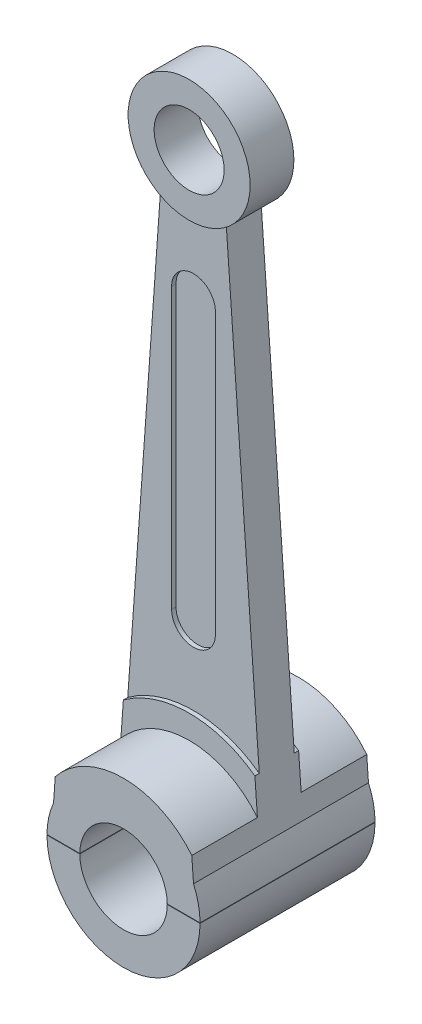
ISO-10303-21;
HEADER;
FILE_DESCRIPTION(('STEP AP214'),'2;1');
FILE_NAME('part.step','',(''),(''),'','','');
FILE_SCHEMA(('AUTOMOTIVE_DESIGN { 1 0 10303 214 1 1 1 1 }'));
ENDSEC;
DATA;
#1=APPLICATION_CONTEXT('core data for automotive mechanical design processes');
#2=APPLICATION_PROTOCOL_DEFINITION('international standard','automotive_design',2000,#1);
#3=PRODUCT_CONTEXT('',#1,'mechanical');
#4=PRODUCT('Part','Part','',(#3));
#5=PRODUCT_RELATED_PRODUCT_CATEGORY('part','',(#4));
#6=PRODUCT_DEFINITION_FORMATION('','',#4);
#7=PRODUCT_DEFINITION_CONTEXT('part definition',#1,'design');
#8=PRODUCT_DEFINITION('design','',#6,#7);
#9=PRODUCT_DEFINITION_SHAPE('','',#8);
#10=(LENGTH_UNIT() NAMED_UNIT(*) SI_UNIT(.MILLI.,.METRE.));
#11=(NAMED_UNIT(*) PLANE_ANGLE_UNIT() SI_UNIT($,.RADIAN.));
#12=(NAMED_UNIT(*) SI_UNIT($,.STERADIAN.) SOLID_ANGLE_UNIT());
#13=UNCERTAINTY_MEASURE_WITH_UNIT(LENGTH_MEASURE(1.E-05),#10,'distance_accuracy_value','');
#14=(GEOMETRIC_REPRESENTATION_CONTEXT(3) GLOBAL_UNCERTAINTY_ASSIGNED_CONTEXT((#13)) GLOBAL_UNIT_ASSIGNED_CONTEXT((#10,
#11,#12)) REPRESENTATION_CONTEXT('',''));
#15=CARTESIAN_POINT('',(0.,0.,0.));
#16=DIRECTION('',(0.,0.,1.));
#17=DIRECTION('',(1.,0.,0.));
#18=AXIS2_PLACEMENT_3D('',#15,#16,#17);
#19=CARTESIAN_POINT('',(-2.23895912387311,-6.14381045300894,-13.75));
#20=DIRECTION('',(0.,0.,1.));
#21=DIRECTION('',(1.,0.,0.));
#22=AXIS2_PLACEMENT_3D('',#19,#20,#21);
#23=CYLINDRICAL_SURFACE('',#22,1.75);
#24=CARTESIAN_POINT('',(-2.23895912387311,-6.14381045300894,-2.));
#25=DIRECTION('',(0.,0.,1.));
#26=DIRECTION('',(1.,0.,0.));
#27=AXIS2_PLACEMENT_3D('',#24,#25,#26);
#28=CIRCLE('',#27,1.75);
#29=CARTESIAN_POINT('',(-3.9889305522113,-6.13381045300894,-2.));
#30=VERTEX_POINT('',#29);
#31=CARTESIAN_POINT('',(-3.83895912387311,-5.43493810907105,-2.));
#32=VERTEX_POINT('',#31);
#33=EDGE_CURVE('E304',#30,#32,#28,.F.);
#34=ORIENTED_EDGE('',*,*,#33,.F.);
#35=DIRECTION('',(0.,0.,1.));
#36=VECTOR('',#35,1.);
#37=CARTESIAN_POINT('',(-3.9889305522113,-6.13381045300894,-13.75));
#38=LINE('',#37,#36);
#39=CARTESIAN_POINT('',(-3.9889305522113,-6.13381045300894,2.));
#40=VERTEX_POINT('',#39);
#41=EDGE_CURVE('E351',#30,#40,#38,.T.);
#42=ORIENTED_EDGE('',*,*,#41,.T.);
#43=CARTESIAN_POINT('',(-2.23895912387311,-6.14381045300894,2.));
#44=DIRECTION('',(0.,0.,1.));
#45=DIRECTION('',(1.,0.,0.));
#46=AXIS2_PLACEMENT_3D('',#43,#44,#45);
#47=CIRCLE('',#46,1.75);
#48=CARTESIAN_POINT('',(-3.83895912387311,-5.43493810907105,2.));
#49=VERTEX_POINT('',#48);
#50=EDGE_CURVE('E286',#40,#49,#47,.F.);
#51=ORIENTED_EDGE('',*,*,#50,.T.);
#52=DIRECTION('',(0.,0.,1.));
#53=VECTOR('',#52,1.);
#54=CARTESIAN_POINT('',(-3.83895912387311,-5.43493810907105,-13.75));
#55=LINE('',#54,#53);
#56=EDGE_CURVE('E301',#32,#49,#55,.T.);
#57=ORIENTED_EDGE('',*,*,#56,.F.);
#58=EDGE_LOOP('',(#34,#42,#51,#57));
#59=FACE_BOUND('',#58,.T.);
#60=ADVANCED_FACE('F51',(#59),#23,.T.);
#61=CARTESIAN_POINT('',(-2.23895912387311,-6.14381045300894,0.5));
#62=DIRECTION('',(0.,0.,-1.));
#63=DIRECTION('',(-1.,0.,0.));
#64=AXIS2_PLACEMENT_3D('',#61,#62,#63);
#65=CYLINDRICAL_SURFACE('',#64,2.54);
#66=CARTESIAN_POINT('',(-2.23895912387311,-6.14381045300894,0.5));
#67=DIRECTION('',(0.,0.,1.));
#68=DIRECTION('',(1.,0.,0.));
#69=AXIS2_PLACEMENT_3D('',#66,#67,#68);
#70=CIRCLE('',#69,2.54);
#71=CARTESIAN_POINT('',(-0.735317686791805,-4.09669970156141,0.5));
#72=VERTEX_POINT('',#71);
#73=CARTESIAN_POINT('',(-3.74260056095441,-4.09669970156141,0.5));
#74=VERTEX_POINT('',#73);
#75=EDGE_CURVE('E204',#72,#74,#70,.T.);
#76=ORIENTED_EDGE('',*,*,#75,.F.);
#77=DIRECTION('',(0.,0.,-1.));
#78=VECTOR('',#77,1.);
#79=CARTESIAN_POINT('',(-0.735317686791805,-4.09669970156141,0.5));
#80=LINE('',#79,#78);
#81=CARTESIAN_POINT('',(-0.735317686791805,-4.09669970156141,0.4));
#82=VERTEX_POINT('',#81);
#83=EDGE_CURVE('E282',#72,#82,#80,.T.);
#84=ORIENTED_EDGE('',*,*,#83,.T.);
#85=CARTESIAN_POINT('',(-2.23895912387311,-6.14381045300894,0.4));
#86=DIRECTION('',(0.,0.,1.));
#87=DIRECTION('',(1.,0.,0.));
#88=AXIS2_PLACEMENT_3D('',#85,#86,#87);
#89=CIRCLE('',#88,2.54);
#90=CARTESIAN_POINT('',(-3.74260056095441,-4.09669970156141,0.4));
#91=VERTEX_POINT('',#90);
#92=EDGE_CURVE('E175',#82,#91,#89,.T.);
#93=ORIENTED_EDGE('',*,*,#92,.T.);
#94=DIRECTION('',(0.,0.,-1.));
#95=VECTOR('',#94,1.);
#96=CARTESIAN_POINT('',(-3.74260056095441,-4.09669970156141,0.5));
#97=LINE('',#96,#95);
#98=EDGE_CURVE('E136',#91,#74,#97,.F.);
#99=ORIENTED_EDGE('',*,*,#98,.T.);
#100=EDGE_LOOP('',(#76,#84,#93,#99));
#101=FACE_BOUND('',#100,.T.);
#102=ADVANCED_FACE('F534',(#101),#65,.T.);
#103=CARTESIAN_POINT('',(-2.23895912387311,4.54618954699106,0.4));
#104=DIRECTION('',(0.,0.,-1.));
#105=DIRECTION('',(-1.,0.,0.));
#106=AXIS2_PLACEMENT_3D('',#103,#104,#105);
#107=CYLINDRICAL_SURFACE('',#106,0.499999999999999);
#108=DIRECTION('',(0.,0.,-1.));
#109=VECTOR('',#108,1.);
#110=CARTESIAN_POINT('',(-1.73895912387311,4.54618954699106,0.4));
#111=LINE('',#110,#109);
#112=CARTESIAN_POINT('',(-1.73895912387311,4.54618954699106,-0.3));
#113=VERTEX_POINT('',#112);
#114=CARTESIAN_POINT('',(-1.73895912387311,4.54618954699106,-0.4));
#115=VERTEX_POINT('',#114);
#116=EDGE_CURVE('E389',#113,#115,#111,.T.);
#117=ORIENTED_EDGE('',*,*,#116,.F.);
#118=CARTESIAN_POINT('',(-2.23895912387311,4.54618954699106,-0.3));
#119=DIRECTION('',(0.,0.,1.));
#120=DIRECTION('',(1.,0.,0.));
#121=AXIS2_PLACEMENT_3D('',#118,#119,#120);
#122=CIRCLE('',#121,0.499999999999999);
#123=CARTESIAN_POINT('',(-2.73895912387311,4.54618954699106,-0.3));
#124=VERTEX_POINT('',#123);
#125=EDGE_CURVE('E213',#113,#124,#122,.T.);
#126=ORIENTED_EDGE('',*,*,#125,.T.);
#127=DIRECTION('',(0.,0.,-1.));
#128=VECTOR('',#127,1.);
#129=CARTESIAN_POINT('',(-2.73895912387311,4.54618954699106,0.4));
#130=LINE('',#129,#128);
#131=CARTESIAN_POINT('',(-2.73895912387311,4.54618954699106,-0.4));
#132=VERTEX_POINT('',#131);
#133=EDGE_CURVE('E217',#124,#132,#130,.T.);
#134=ORIENTED_EDGE('',*,*,#133,.T.);
#135=CARTESIAN_POINT('',(-2.23895912387311,4.54618954699106,-0.4));
#136=DIRECTION('',(0.,0.,1.));
#137=DIRECTION('',(1.,0.,0.));
#138=AXIS2_PLACEMENT_3D('',#135,#136,#137);
#139=CIRCLE('',#138,0.499999999999999);
#140=EDGE_CURVE('E191',#115,#132,#139,.T.);
#141=ORIENTED_EDGE('',*,*,#140,.F.);
#142=EDGE_LOOP('',(#117,#126,#134,#141));
#143=FACE_BOUND('',#142,.T.);
#144=ADVANCED_FACE('F542',(#143),#107,.F.);
#145=CARTESIAN_POINT('',(-1.73895912387311,0.,0.4));
#146=DIRECTION('',(1.,0.,0.));
#147=DIRECTION('',(0.,1.,0.));
#148=AXIS2_PLACEMENT_3D('',#145,#146,#147);
#149=PLANE('',#148);
#150=DIRECTION('',(0.,-1.,0.));
#151=VECTOR('',#150,1.);
#152=CARTESIAN_POINT('',(-1.73895912387311,0.,-0.3));
#153=LINE('',#152,#151);
#154=CARTESIAN_POINT('',(-1.73895912387311,-1.85247213225215,-0.3));
#155=VERTEX_POINT('',#154);
#156=EDGE_CURVE('E218',#113,#155,#153,.T.);
#157=ORIENTED_EDGE('',*,*,#156,.F.);
#158=ORIENTED_EDGE('',*,*,#116,.T.);
#159=DIRECTION('',(0.,-1.,0.));
#160=VECTOR('',#159,1.);
#161=CARTESIAN_POINT('',(-1.73895912387311,0.,-0.4));
#162=LINE('',#161,#160);
#163=CARTESIAN_POINT('',(-1.73895912387311,-1.85247213225215,-0.4));
#164=VERTEX_POINT('',#163);
#165=EDGE_CURVE('E228',#115,#164,#162,.T.);
#166=ORIENTED_EDGE('',*,*,#165,.T.);
#167=DIRECTION('',(0.,0.,-1.));
#168=VECTOR('',#167,1.);
#169=CARTESIAN_POINT('',(-1.73895912387311,-1.85247213225215,0.4));
#170=LINE('',#169,#168);
#171=EDGE_CURVE('E212',#155,#164,#170,.T.);
#172=ORIENTED_EDGE('',*,*,#171,.F.);
#173=EDGE_LOOP('',(#157,#158,#166,#172));
#174=FACE_BOUND('',#173,.T.);
#175=ADVANCED_FACE('F541',(#174),#149,.F.);
#176=CARTESIAN_POINT('',(-2.23895912387311,-1.85247213225215,0.4));
#177=DIRECTION('',(0.,0.,-1.));
#178=DIRECTION('',(-1.,0.,0.));
#179=AXIS2_PLACEMENT_3D('',#176,#177,#178);
#180=CYLINDRICAL_SURFACE('',#179,0.5);
#181=DIRECTION('',(0.,0.,-1.));
#182=VECTOR('',#181,1.);
#183=CARTESIAN_POINT('',(-2.73895912387311,-1.85247213225215,0.4));
#184=LINE('',#183,#182);
#185=CARTESIAN_POINT('',(-2.73895912387311,-1.85247213225215,-0.3));
#186=VERTEX_POINT('',#185);
#187=CARTESIAN_POINT('',(-2.73895912387311,-1.85247213225215,-0.4));
#188=VERTEX_POINT('',#187);
#189=EDGE_CURVE('E163',#186,#188,#184,.T.);
#190=ORIENTED_EDGE('',*,*,#189,.F.);
#191=CARTESIAN_POINT('',(-2.23895912387311,-1.85247213225215,-0.3));
#192=DIRECTION('',(0.,0.,1.));
#193=DIRECTION('',(1.,0.,0.));
#194=AXIS2_PLACEMENT_3D('',#191,#192,#193);
#195=CIRCLE('',#194,0.5);
#196=EDGE_CURVE('E224',#186,#155,#195,.T.);
#197=ORIENTED_EDGE('',*,*,#196,.T.);
#198=ORIENTED_EDGE('',*,*,#171,.T.);
#199=CARTESIAN_POINT('',(-2.23895912387311,-1.85247213225215,-0.4));
#200=DIRECTION('',(0.,0.,1.));
#201=DIRECTION('',(1.,0.,0.));
#202=AXIS2_PLACEMENT_3D('',#199,#200,#201);
#203=CIRCLE('',#202,0.5);
#204=EDGE_CURVE('E403',#188,#164,#203,.T.);
#205=ORIENTED_EDGE('',*,*,#204,.F.);
#206=EDGE_LOOP('',(#190,#197,#198,#205));
#207=FACE_BOUND('',#206,.T.);
#208=ADVANCED_FACE('F441',(#207),#180,.F.);
#209=CARTESIAN_POINT('',(-2.73895912387311,0.,0.4));
#210=DIRECTION('',(1.,0.,0.));
#211=DIRECTION('',(0.,1.,0.));
#212=AXIS2_PLACEMENT_3D('',#209,#210,#211);
#213=PLANE('',#212);
#214=ORIENTED_EDGE('',*,*,#133,.F.);
#215=DIRECTION('',(0.,-1.,0.));
#216=VECTOR('',#215,1.);
#217=CARTESIAN_POINT('',(-2.73895912387311,0.,-0.3));
#218=LINE('',#217,#216);
#219=EDGE_CURVE('E170',#124,#186,#218,.T.);
#220=ORIENTED_EDGE('',*,*,#219,.T.);
#221=ORIENTED_EDGE('',*,*,#189,.T.);
#222=DIRECTION('',(0.,-1.,0.));
#223=VECTOR('',#222,1.);
#224=CARTESIAN_POINT('',(-2.73895912387311,0.,-0.4));
#225=LINE('',#224,#223);
#226=EDGE_CURVE('E404',#132,#188,#225,.T.);
#227=ORIENTED_EDGE('',*,*,#226,.F.);
#228=EDGE_LOOP('',(#214,#220,#221,#227));
#229=FACE_BOUND('',#228,.T.);
#230=ADVANCED_FACE('F430',(#229),#213,.T.);
#231=CARTESIAN_POINT('',(-2.23895912387311,7.54618954699106,0.5));
#232=DIRECTION('',(0.,0.,-1.));
#233=DIRECTION('',(-1.,0.,0.));
#234=AXIS2_PLACEMENT_3D('',#231,#232,#233);
#235=CYLINDRICAL_SURFACE('',#234,1.395);
#236=CARTESIAN_POINT('',(-2.23895912387311,7.54618954699106,0.4));
#237=DIRECTION('',(0.,0.,1.));
#238=DIRECTION('',(1.,0.,0.));
#239=AXIS2_PLACEMENT_3D('',#236,#237,#238);
#240=CIRCLE('',#239,1.395);
#241=CARTESIAN_POINT('',(-2.98895912387311,6.36995615178414,0.399999999999999));
#242=VERTEX_POINT('',#241);
#243=CARTESIAN_POINT('',(-1.48895912387311,6.36995615178414,0.399999999999999));
#244=VERTEX_POINT('',#243);
#245=EDGE_CURVE('E151',#242,#244,#240,.T.);
#246=ORIENTED_EDGE('',*,*,#245,.T.);
#247=DIRECTION('',(0.,0.,-1.));
#248=VECTOR('',#247,1.);
#249=CARTESIAN_POINT('',(-1.48895912387311,6.36995615178413,0.4));
#250=LINE('',#249,#248);
#251=CARTESIAN_POINT('',(-1.48895912387311,6.36995615178414,-0.399999999999999));
#252=VERTEX_POINT('',#251);
#253=EDGE_CURVE('E162',#244,#252,#250,.T.);
#254=ORIENTED_EDGE('',*,*,#253,.T.);
#255=CARTESIAN_POINT('',(-2.23895912387311,7.54618954699106,-0.4));
#256=DIRECTION('',(0.,0.,1.));
#257=DIRECTION('',(1.,0.,0.));
#258=AXIS2_PLACEMENT_3D('',#255,#256,#257);
#259=CIRCLE('',#258,1.395);
#260=CARTESIAN_POINT('',(-2.98895912387311,6.36995615178414,-0.399999999999999));
#261=VERTEX_POINT('',#260);
#262=EDGE_CURVE('E153',#261,#252,#259,.T.);
#263=ORIENTED_EDGE('',*,*,#262,.F.);
#264=DIRECTION('',(0.,0.,-1.));
#265=VECTOR('',#264,1.);
#266=CARTESIAN_POINT('',(-2.98895912387311,6.36995615178413,0.4));
#267=LINE('',#266,#265);
#268=EDGE_CURVE('E134',#242,#261,#267,.T.);
#269=ORIENTED_EDGE('',*,*,#268,.F.);
#270=EDGE_LOOP('',(#246,#254,#263,#269));
#271=FACE_BOUND('',#270,.T.);
#272=CARTESIAN_POINT('',(-2.23895912387311,7.54618954699106,-0.5));
#273=DIRECTION('',(0.,0.,1.));
#274=DIRECTION('',(1.,0.,0.));
#275=AXIS2_PLACEMENT_3D('',#272,#273,#274);
#276=CIRCLE('',#275,1.395);
#277=CARTESIAN_POINT('',(-0.843959123873107,7.54618954699106,-0.5));
#278=VERTEX_POINT('',#277);
#279=EDGE_CURVE('E167',#278,#278,#276,.T.);
#280=ORIENTED_EDGE('',*,*,#279,.T.);
#281=EDGE_LOOP('',(#280));
#282=FACE_BOUND('',#281,.T.);
#283=CARTESIAN_POINT('',(-2.23895912387311,7.54618954699106,0.5));
#284=DIRECTION('',(0.,0.,1.));
#285=DIRECTION('',(1.,0.,0.));
#286=AXIS2_PLACEMENT_3D('',#283,#284,#285);
#287=CIRCLE('',#286,1.395);
#288=CARTESIAN_POINT('',(-0.843959123873107,7.54618954699106,0.5));
#289=VERTEX_POINT('',#288);
#290=EDGE_CURVE('E375',#289,#289,#287,.T.);
#291=ORIENTED_EDGE('',*,*,#290,.F.);
#292=EDGE_LOOP('',(#291));
#293=FACE_BOUND('',#292,.T.);
#294=ADVANCED_FACE('F147',(#271,#282,#293),#235,.T.);
#295=CARTESIAN_POINT('',(-2.23895912387311,7.54618954699106,0.5));
#296=DIRECTION('',(0.,0.,-1.));
#297=DIRECTION('',(-1.,0.,0.));
#298=AXIS2_PLACEMENT_3D('',#295,#296,#297);
#299=CYLINDRICAL_SURFACE('',#298,0.8);
#300=CARTESIAN_POINT('',(-2.23895912387311,7.54618954699106,0.5));
#301=DIRECTION('',(0.,0.,1.));
#302=DIRECTION('',(1.,0.,0.));
#303=AXIS2_PLACEMENT_3D('',#300,#301,#302);
#304=CIRCLE('',#303,0.8);
#305=CARTESIAN_POINT('',(-1.43895912387311,7.54618954699106,0.5));
#306=VERTEX_POINT('',#305);
#307=EDGE_CURVE('E379',#306,#306,#304,.T.);
#308=ORIENTED_EDGE('',*,*,#307,.T.);
#309=EDGE_LOOP('',(#308));
#310=FACE_BOUND('',#309,.T.);
#311=CARTESIAN_POINT('',(-2.23895912387311,7.54618954699106,-0.5));
#312=DIRECTION('',(0.,0.,1.));
#313=DIRECTION('',(1.,0.,0.));
#314=AXIS2_PLACEMENT_3D('',#311,#312,#313);
#315=CIRCLE('',#314,0.8);
#316=CARTESIAN_POINT('',(-1.43895912387311,7.54618954699106,-0.5));
#317=VERTEX_POINT('',#316);
#318=EDGE_CURVE('E197',#317,#317,#315,.T.);
#319=ORIENTED_EDGE('',*,*,#318,.F.);
#320=EDGE_LOOP('',(#319));
#321=FACE_BOUND('',#320,.T.);
#322=ADVANCED_FACE('F751',(#310,#321),#299,.F.);
#323=CARTESIAN_POINT('',(0.,0.,0.5));
#324=DIRECTION('',(0.,0.,1.));
#325=DIRECTION('',(1.,0.,0.));
#326=AXIS2_PLACEMENT_3D('',#323,#324,#325);
#327=PLANE('',#326);
#328=ORIENTED_EDGE('',*,*,#290,.T.);
#329=EDGE_LOOP('',(#328));
#330=FACE_BOUND('',#329,.T.);
#331=ORIENTED_EDGE('',*,*,#307,.F.);
#332=EDGE_LOOP('',(#331));
#333=FACE_BOUND('',#332,.T.);
#334=ADVANCED_FACE('F741',(#330,#333),#327,.T.);
#335=CARTESIAN_POINT('',(0.,0.,-0.5));
#336=DIRECTION('',(0.,0.,1.));
#337=DIRECTION('',(1.,0.,0.));
#338=AXIS2_PLACEMENT_3D('',#335,#336,#337);
#339=PLANE('',#338);
#340=ORIENTED_EDGE('',*,*,#279,.F.);
#341=EDGE_LOOP('',(#340));
#342=FACE_BOUND('',#341,.T.);
#343=ORIENTED_EDGE('',*,*,#318,.T.);
#344=EDGE_LOOP('',(#343));
#345=FACE_BOUND('',#344,.T.);
#346=ADVANCED_FACE('F732',(#342,#345),#339,.F.);
#347=CARTESIAN_POINT('',(-2.23895912387311,4.54618954699106,0.3));
#348=DIRECTION('',(0.,0.,1.));
#349=DIRECTION('',(1.,0.,0.));
#350=AXIS2_PLACEMENT_3D('',#347,#348,#349);
#351=CIRCLE('',#350,0.499999999999999);
#352=CARTESIAN_POINT('',(-1.73895912387311,4.54618954699106,0.3));
#353=VERTEX_POINT('',#352);
#354=CARTESIAN_POINT('',(-2.73895912387311,4.54618954699106,0.3));
#355=VERTEX_POINT('',#354);
#356=EDGE_CURVE('E234',#353,#355,#351,.T.);
#357=ORIENTED_EDGE('',*,*,#356,.F.);
#358=CARTESIAN_POINT('',(-1.73895912387311,4.54618954699106,0.4));
#359=VERTEX_POINT('',#358);
#360=EDGE_CURVE('E241',#359,#353,#111,.T.);
#361=ORIENTED_EDGE('',*,*,#360,.F.);
#362=CARTESIAN_POINT('',(-2.23895912387311,4.54618954699106,0.4));
#363=DIRECTION('',(0.,0.,1.));
#364=DIRECTION('',(1.,0.,0.));
#365=AXIS2_PLACEMENT_3D('',#362,#363,#364);
#366=CIRCLE('',#365,0.499999999999999);
#367=CARTESIAN_POINT('',(-2.73895912387311,4.54618954699106,0.4));
#368=VERTEX_POINT('',#367);
#369=EDGE_CURVE('E192',#359,#368,#366,.T.);
#370=ORIENTED_EDGE('',*,*,#369,.T.);
#371=EDGE_CURVE('E196',#368,#355,#130,.T.);
#372=ORIENTED_EDGE('',*,*,#371,.T.);
#373=EDGE_LOOP('',(#357,#361,#370,#372));
#374=FACE_BOUND('',#373,.T.);
#375=ADVANCED_FACE('F557',(#374),#107,.F.);
#376=ORIENTED_EDGE('',*,*,#360,.T.);
#377=DIRECTION('',(0.,-1.,0.));
#378=VECTOR('',#377,1.);
#379=CARTESIAN_POINT('',(-1.73895912387311,0.,0.3));
#380=LINE('',#379,#378);
#381=CARTESIAN_POINT('',(-1.73895912387311,-1.85247213225215,0.3));
#382=VERTEX_POINT('',#381);
#383=EDGE_CURVE('E186',#353,#382,#380,.T.);
#384=ORIENTED_EDGE('',*,*,#383,.T.);
#385=CARTESIAN_POINT('',(-1.73895912387311,-1.85247213225215,0.4));
#386=VERTEX_POINT('',#385);
#387=EDGE_CURVE('E181',#386,#382,#170,.T.);
#388=ORIENTED_EDGE('',*,*,#387,.F.);
#389=DIRECTION('',(0.,-1.,0.));
#390=VECTOR('',#389,1.);
#391=CARTESIAN_POINT('',(-1.73895912387311,0.,0.4));
#392=LINE('',#391,#390);
#393=EDGE_CURVE('E187',#359,#386,#392,.T.);
#394=ORIENTED_EDGE('',*,*,#393,.F.);
#395=EDGE_LOOP('',(#376,#384,#388,#394));
#396=FACE_BOUND('',#395,.T.);
#397=ADVANCED_FACE('F564',(#396),#149,.F.);
#398=CARTESIAN_POINT('',(-2.23895912387311,-1.85247213225215,0.3));
#399=DIRECTION('',(0.,0.,1.));
#400=DIRECTION('',(1.,0.,0.));
#401=AXIS2_PLACEMENT_3D('',#398,#399,#400);
#402=CIRCLE('',#401,0.5);
#403=CARTESIAN_POINT('',(-2.73895912387311,-1.85247213225215,0.3));
#404=VERTEX_POINT('',#403);
#405=EDGE_CURVE('E222',#404,#382,#402,.T.);
#406=ORIENTED_EDGE('',*,*,#405,.F.);
#407=CARTESIAN_POINT('',(-2.73895912387311,-1.85247213225215,0.4));
#408=VERTEX_POINT('',#407);
#409=EDGE_CURVE('E172',#408,#404,#184,.T.);
#410=ORIENTED_EDGE('',*,*,#409,.F.);
#411=CARTESIAN_POINT('',(-2.23895912387311,-1.85247213225215,0.4));
#412=DIRECTION('',(0.,0.,1.));
#413=DIRECTION('',(1.,0.,0.));
#414=AXIS2_PLACEMENT_3D('',#411,#412,#413);
#415=CIRCLE('',#414,0.5);
#416=EDGE_CURVE('E182',#408,#386,#415,.T.);
#417=ORIENTED_EDGE('',*,*,#416,.T.);
#418=ORIENTED_EDGE('',*,*,#387,.T.);
#419=EDGE_LOOP('',(#406,#410,#417,#418));
#420=FACE_BOUND('',#419,.T.);
#421=ADVANCED_FACE('F567',(#420),#180,.F.);
#422=DIRECTION('',(0.,-1.,0.));
#423=VECTOR('',#422,1.);
#424=CARTESIAN_POINT('',(-2.73895912387311,0.,0.3));
#425=LINE('',#424,#423);
#426=EDGE_CURVE('E229',#355,#404,#425,.T.);
#427=ORIENTED_EDGE('',*,*,#426,.F.);
#428=ORIENTED_EDGE('',*,*,#371,.F.);
#429=DIRECTION('',(0.,-1.,0.));
#430=VECTOR('',#429,1.);
#431=CARTESIAN_POINT('',(-2.73895912387311,0.,0.4));
#432=LINE('',#431,#430);
#433=EDGE_CURVE('E177',#368,#408,#432,.T.);
#434=ORIENTED_EDGE('',*,*,#433,.T.);
#435=ORIENTED_EDGE('',*,*,#409,.T.);
#436=EDGE_LOOP('',(#427,#428,#434,#435));
#437=FACE_BOUND('',#436,.T.);
#438=ADVANCED_FACE('F552',(#437),#213,.T.);
#439=CARTESIAN_POINT('',(0.,0.,0.4));
#440=DIRECTION('',(0.,0.,1.));
#441=DIRECTION('',(1.,0.,0.));
#442=AXIS2_PLACEMENT_3D('',#439,#440,#441);
#443=PLANE('',#442);
#444=DIRECTION('',(0.0718181006562887,-0.997417746191696,0.));
#445=VECTOR('',#444,1.);
#446=CARTESIAN_POINT('',(-1.02498248418366,-0.0738028729698247,0.4));
#447=LINE('',#446,#445);
#448=EDGE_CURVE('E160',#244,#82,#447,.T.);
#449=ORIENTED_EDGE('',*,*,#448,.F.);
#450=ORIENTED_EDGE('',*,*,#245,.F.);
#451=DIRECTION('',(0.0718181006562887,0.997417746191696,0.));
#452=VECTOR('',#451,1.);
#453=CARTESIAN_POINT('',(-3.42983937957992,0.246962269057354,0.4));
#454=LINE('',#453,#452);
#455=EDGE_CURVE('E131',#91,#242,#454,.T.);
#456=ORIENTED_EDGE('',*,*,#455,.F.);
#457=ORIENTED_EDGE('',*,*,#92,.F.);
#458=EDGE_LOOP('',(#449,#450,#456,#457));
#459=FACE_BOUND('',#458,.T.);
#460=ORIENTED_EDGE('',*,*,#369,.F.);
#461=ORIENTED_EDGE('',*,*,#393,.T.);
#462=ORIENTED_EDGE('',*,*,#416,.F.);
#463=ORIENTED_EDGE('',*,*,#433,.F.);
#464=EDGE_LOOP('',(#460,#461,#462,#463));
#465=FACE_BOUND('',#464,.T.);
#466=ADVANCED_FACE('F157',(#459,#465),#443,.T.);
#467=CARTESIAN_POINT('',(0.,0.,-0.4));
#468=DIRECTION('',(0.,0.,1.));
#469=DIRECTION('',(1.,0.,0.));
#470=AXIS2_PLACEMENT_3D('',#467,#468,#469);
#471=PLANE('',#470);
#472=ORIENTED_EDGE('',*,*,#140,.T.);
#473=ORIENTED_EDGE('',*,*,#226,.T.);
#474=ORIENTED_EDGE('',*,*,#204,.T.);
#475=ORIENTED_EDGE('',*,*,#165,.F.);
#476=EDGE_LOOP('',(#472,#473,#474,#475));
#477=FACE_BOUND('',#476,.T.);
#478=ORIENTED_EDGE('',*,*,#262,.T.);
#479=DIRECTION('',(0.0718181006562887,-0.997417746191696,0.));
#480=VECTOR('',#479,1.);
#481=CARTESIAN_POINT('',(-1.02498248418366,-0.0738028729698247,-0.4));
#482=LINE('',#481,#480);
#483=CARTESIAN_POINT('',(-0.735317686791805,-4.09669970156141,-0.4));
#484=VERTEX_POINT('',#483);
#485=EDGE_CURVE('E258',#252,#484,#482,.T.);
#486=ORIENTED_EDGE('',*,*,#485,.T.);
#487=CARTESIAN_POINT('',(-2.23895912387311,-6.14381045300894,-0.4));
#488=DIRECTION('',(0.,0.,1.));
#489=DIRECTION('',(1.,0.,0.));
#490=AXIS2_PLACEMENT_3D('',#487,#488,#489);
#491=CIRCLE('',#490,2.54);
#492=CARTESIAN_POINT('',(-3.74260056095441,-4.09669970156141,-0.4));
#493=VERTEX_POINT('',#492);
#494=EDGE_CURVE('E262',#484,#493,#491,.T.);
#495=ORIENTED_EDGE('',*,*,#494,.T.);
#496=DIRECTION('',(0.0718181006562887,0.997417746191696,0.));
#497=VECTOR('',#496,1.);
#498=CARTESIAN_POINT('',(-3.42983937957992,0.246962269057354,-0.4));
#499=LINE('',#498,#497);
#500=EDGE_CURVE('E102',#493,#261,#499,.T.);
#501=ORIENTED_EDGE('',*,*,#500,.T.);
#502=EDGE_LOOP('',(#478,#486,#495,#501));
#503=FACE_BOUND('',#502,.T.);
#504=ADVANCED_FACE('F420',(#477,#503),#471,.F.);
#505=ORIENTED_EDGE('',*,*,#494,.F.);
#506=CARTESIAN_POINT('',(-0.735317686791805,-4.09669970156141,-0.5));
#507=VERTEX_POINT('',#506);
#508=EDGE_CURVE('E203',#484,#507,#80,.T.);
#509=ORIENTED_EDGE('',*,*,#508,.T.);
#510=CARTESIAN_POINT('',(-2.23895912387311,-6.14381045300894,-0.5));
#511=DIRECTION('',(0.,0.,1.));
#512=DIRECTION('',(1.,0.,0.));
#513=AXIS2_PLACEMENT_3D('',#510,#511,#512);
#514=CIRCLE('',#513,2.54);
#515=CARTESIAN_POINT('',(-3.74260056095441,-4.09669970156141,-0.5));
#516=VERTEX_POINT('',#515);
#517=EDGE_CURVE('E198',#507,#516,#514,.T.);
#518=ORIENTED_EDGE('',*,*,#517,.T.);
#519=EDGE_CURVE('E202',#516,#493,#97,.F.);
#520=ORIENTED_EDGE('',*,*,#519,.T.);
#521=EDGE_LOOP('',(#505,#509,#518,#520));
#522=FACE_BOUND('',#521,.T.);
#523=ADVANCED_FACE('F499',(#522),#65,.T.);
#524=CARTESIAN_POINT('',(0.,0.,0.5));
#525=DIRECTION('',(0.,0.,1.));
#526=DIRECTION('',(1.,0.,0.));
#527=AXIS2_PLACEMENT_3D('',#524,#525,#526);
#528=PLANE('',#527);
#529=DIRECTION('',(0.0718181006562887,-0.997417746191696,0.));
#530=VECTOR('',#529,1.);
#531=CARTESIAN_POINT('',(-1.02498248418366,-0.0738028729698247,0.5));
#532=LINE('',#531,#530);
#533=CARTESIAN_POINT('',(-0.677943529425467,-4.89351836157939,0.5));
#534=VERTEX_POINT('',#533);
#535=EDGE_CURVE('E280',#72,#534,#532,.T.);
#536=ORIENTED_EDGE('',*,*,#535,.F.);
#537=ORIENTED_EDGE('',*,*,#75,.T.);
#538=DIRECTION('',(0.0718181006562887,0.997417746191696,0.));
#539=VECTOR('',#538,1.);
#540=CARTESIAN_POINT('',(-3.42983937957992,0.246962269057354,0.5));
#541=LINE('',#540,#539);
#542=CARTESIAN_POINT('',(-3.79997471832075,-4.89351836157939,0.5));
#543=VERTEX_POINT('',#542);
#544=EDGE_CURVE('E142',#543,#74,#541,.T.);
#545=ORIENTED_EDGE('',*,*,#544,.F.);
#546=CARTESIAN_POINT('',(-2.23895912387311,-6.14381045300894,0.5));
#547=DIRECTION('',(0.,0.,1.));
#548=DIRECTION('',(1.,0.,0.));
#549=AXIS2_PLACEMENT_3D('',#546,#547,#548);
#550=CIRCLE('',#549,2.);
#551=EDGE_CURVE('E245',#534,#543,#550,.T.);
#552=ORIENTED_EDGE('',*,*,#551,.F.);
#553=EDGE_LOOP('',(#536,#537,#545,#552));
#554=FACE_BOUND('',#553,.T.);
#555=ADVANCED_FACE('F531',(#554),#528,.T.);
#556=CARTESIAN_POINT('',(0.,0.,-0.5));
#557=DIRECTION('',(0.,0.,1.));
#558=DIRECTION('',(1.,0.,0.));
#559=AXIS2_PLACEMENT_3D('',#556,#557,#558);
#560=PLANE('',#559);
#561=ORIENTED_EDGE('',*,*,#517,.F.);
#562=DIRECTION('',(0.0718181006562887,-0.997417746191696,0.));
#563=VECTOR('',#562,1.);
#564=CARTESIAN_POINT('',(-1.02498248418366,-0.0738028729698247,-0.5));
#565=LINE('',#564,#563);
#566=CARTESIAN_POINT('',(-0.677943529425467,-4.89351836157939,-0.5));
#567=VERTEX_POINT('',#566);
#568=EDGE_CURVE('E208',#507,#567,#565,.T.);
#569=ORIENTED_EDGE('',*,*,#568,.T.);
#570=CARTESIAN_POINT('',(-2.23895912387311,-6.14381045300894,-0.5));
#571=DIRECTION('',(0.,0.,1.));
#572=DIRECTION('',(1.,0.,0.));
#573=AXIS2_PLACEMENT_3D('',#570,#571,#572);
#574=CIRCLE('',#573,2.);
#575=CARTESIAN_POINT('',(-3.79997471832075,-4.89351836157939,-0.5));
#576=VERTEX_POINT('',#575);
#577=EDGE_CURVE('E266',#567,#576,#574,.T.);
#578=ORIENTED_EDGE('',*,*,#577,.T.);
#579=DIRECTION('',(0.0718181006562887,0.997417746191696,0.));
#580=VECTOR('',#579,1.);
#581=CARTESIAN_POINT('',(-3.42983937957992,0.246962269057354,-0.5));
#582=LINE('',#581,#580);
#583=EDGE_CURVE('E223',#576,#516,#582,.T.);
#584=ORIENTED_EDGE('',*,*,#583,.T.);
#585=EDGE_LOOP('',(#561,#569,#578,#584));
#586=FACE_BOUND('',#585,.T.);
#587=ADVANCED_FACE('F516',(#586),#560,.F.);
#588=CARTESIAN_POINT('',(0.,0.,-0.3));
#589=DIRECTION('',(0.,0.,1.));
#590=DIRECTION('',(1.,0.,0.));
#591=AXIS2_PLACEMENT_3D('',#588,#589,#590);
#592=PLANE('',#591);
#593=ORIENTED_EDGE('',*,*,#196,.F.);
#594=ORIENTED_EDGE('',*,*,#219,.F.);
#595=ORIENTED_EDGE('',*,*,#125,.F.);
#596=ORIENTED_EDGE('',*,*,#156,.T.);
#597=EDGE_LOOP('',(#593,#594,#595,#596));
#598=FACE_BOUND('',#597,.T.);
#599=ADVANCED_FACE('F545',(#598),#592,.F.);
#600=CARTESIAN_POINT('',(0.,0.,0.3));
#601=DIRECTION('',(0.,0.,1.));
#602=DIRECTION('',(1.,0.,0.));
#603=AXIS2_PLACEMENT_3D('',#600,#601,#602);
#604=PLANE('',#603);
#605=ORIENTED_EDGE('',*,*,#405,.T.);
#606=ORIENTED_EDGE('',*,*,#383,.F.);
#607=ORIENTED_EDGE('',*,*,#356,.T.);
#608=ORIENTED_EDGE('',*,*,#426,.T.);
#609=EDGE_LOOP('',(#605,#606,#607,#608));
#610=FACE_BOUND('',#609,.T.);
#611=ADVANCED_FACE('F561',(#610),#604,.T.);
#612=CARTESIAN_POINT('',(-2.23895912387311,-6.14381045300894,-2.));
#613=DIRECTION('',(0.,0.,1.));
#614=DIRECTION('',(1.,0.,0.));
#615=AXIS2_PLACEMENT_3D('',#612,#613,#614);
#616=CYLINDRICAL_SURFACE('',#615,2.);
#617=DIRECTION('',(0.,0.,1.));
#618=VECTOR('',#617,1.);
#619=CARTESIAN_POINT('',(-0.677943529425467,-4.89351836157939,-2.));
#620=LINE('',#619,#618);
#621=CARTESIAN_POINT('',(-0.677943529425467,-4.89351836157939,-2.));
#622=VERTEX_POINT('',#621);
#623=EDGE_CURVE('E267',#622,#567,#620,.T.);
#624=ORIENTED_EDGE('',*,*,#623,.F.);
#625=CARTESIAN_POINT('',(-2.23895912387311,-6.14381045300894,-2.));
#626=DIRECTION('',(0.,0.,1.));
#627=DIRECTION('',(1.,0.,0.));
#628=AXIS2_PLACEMENT_3D('',#625,#626,#627);
#629=CIRCLE('',#628,2.);
#630=CARTESIAN_POINT('',(-3.79997471832075,-4.89351836157939,-2.));
#631=VERTEX_POINT('',#630);
#632=EDGE_CURVE('E233',#622,#631,#629,.T.);
#633=ORIENTED_EDGE('',*,*,#632,.T.);
#634=DIRECTION('',(0.,0.,1.));
#635=VECTOR('',#634,1.);
#636=CARTESIAN_POINT('',(-3.79997471832075,-4.89351836157939,-2.));
#637=LINE('',#636,#635);
#638=EDGE_CURVE('E271',#576,#631,#637,.F.);
#639=ORIENTED_EDGE('',*,*,#638,.F.);
#640=ORIENTED_EDGE('',*,*,#577,.F.);
#641=EDGE_LOOP('',(#624,#633,#639,#640));
#642=FACE_BOUND('',#641,.T.);
#643=ADVANCED_FACE('F514',(#642),#616,.T.);
#644=CARTESIAN_POINT('',(-2.23895912387311,-6.14381045300894,-2.));
#645=DIRECTION('',(0.,0.,1.));
#646=DIRECTION('',(1.,0.,0.));
#647=AXIS2_PLACEMENT_3D('',#644,#645,#646);
#648=PLANE('',#647);
#649=CARTESIAN_POINT('',(-0.638959123873107,-5.43493810907105,-2.));
#650=VERTEX_POINT('',#649);
#651=CARTESIAN_POINT('',(-0.488987695534918,-6.13381045300894,-2.));
#652=VERTEX_POINT('',#651);
#653=EDGE_CURVE('E55',#650,#652,#28,.F.);
#654=ORIENTED_EDGE('',*,*,#653,.T.);
#655=DIRECTION('',(-1.,0.,0.));
#656=VECTOR('',#655,1.);
#657=CARTESIAN_POINT('',(-2.23895912387311,-6.13381045300894,-2.));
#658=LINE('',#657,#656);
#659=CARTESIAN_POINT('',(-1.23900912512317,-6.13381045300894,-2.));
#660=VERTEX_POINT('',#659);
#661=EDGE_CURVE('E323',#652,#660,#658,.T.);
#662=ORIENTED_EDGE('',*,*,#661,.T.);
#663=CARTESIAN_POINT('',(-2.23895912387311,-6.14381045300894,-2.));
#664=DIRECTION('',(0.,0.,1.));
#665=DIRECTION('',(1.,0.,0.));
#666=AXIS2_PLACEMENT_3D('',#663,#664,#665);
#667=CIRCLE('',#666,1.);
#668=CARTESIAN_POINT('',(-3.23890912262304,-6.13381045300894,-2.));
#669=VERTEX_POINT('',#668);
#670=EDGE_CURVE('E327',#660,#669,#667,.T.);
#671=ORIENTED_EDGE('',*,*,#670,.T.);
#672=EDGE_CURVE('E72',#669,#30,#658,.T.);
#673=ORIENTED_EDGE('',*,*,#672,.T.);
#674=ORIENTED_EDGE('',*,*,#33,.T.);
#675=DIRECTION('',(0.0718181006562887,0.997417746191696,0.));
#676=VECTOR('',#675,1.);
#677=CARTESIAN_POINT('',(-3.88148498369782,-6.0255419662271,-2.));
#678=LINE('',#677,#676);
#679=EDGE_CURVE('E277',#32,#631,#678,.T.);
#680=ORIENTED_EDGE('',*,*,#679,.T.);
#681=ORIENTED_EDGE('',*,*,#632,.F.);
#682=DIRECTION('',(0.0718181006562887,-0.997417746191696,0.));
#683=VECTOR('',#682,1.);
#684=CARTESIAN_POINT('',(-0.596433264048398,-6.0255419662271,-2.));
#685=LINE('',#684,#683);
#686=EDGE_CURVE('E273',#622,#650,#685,.T.);
#687=ORIENTED_EDGE('',*,*,#686,.T.);
#688=EDGE_LOOP('',(#654,#662,#671,#673,#674,#680,#681,#687));
#689=FACE_BOUND('',#688,.T.);
#690=ADVANCED_FACE('F53',(#689),#648,.F.);
#691=CARTESIAN_POINT('',(-2.23895912387311,-6.14381045300894,0.5));
#692=DIRECTION('',(0.,0.,-1.));
#693=DIRECTION('',(-1.,0.,0.));
#694=AXIS2_PLACEMENT_3D('',#691,#692,#693);
#695=CYLINDRICAL_SURFACE('',#694,1.);
#696=DIRECTION('',(0.,0.,-1.));
#697=VECTOR('',#696,1.);
#698=CARTESIAN_POINT('',(-1.23900912512317,-6.13381045300894,0.5));
#699=LINE('',#698,#697);
#700=CARTESIAN_POINT('',(-1.23900912512317,-6.13381045300894,2.));
#701=VERTEX_POINT('',#700);
#702=EDGE_CURVE('E322',#701,#660,#699,.T.);
#703=ORIENTED_EDGE('',*,*,#702,.F.);
#704=CARTESIAN_POINT('',(-2.23895912387311,-6.14381045300894,2.));
#705=DIRECTION('',(0.,0.,1.));
#706=DIRECTION('',(1.,0.,0.));
#707=AXIS2_PLACEMENT_3D('',#704,#705,#706);
#708=CIRCLE('',#707,1.);
#709=CARTESIAN_POINT('',(-3.23890912262304,-6.13381045300894,2.));
#710=VERTEX_POINT('',#709);
#711=EDGE_CURVE('E250',#701,#710,#708,.T.);
#712=ORIENTED_EDGE('',*,*,#711,.T.);
#713=DIRECTION('',(0.,0.,-1.));
#714=VECTOR('',#713,1.);
#715=CARTESIAN_POINT('',(-3.23890912262304,-6.13381045300894,0.5));
#716=LINE('',#715,#714);
#717=EDGE_CURVE('E62',#669,#710,#716,.F.);
#718=ORIENTED_EDGE('',*,*,#717,.F.);
#719=ORIENTED_EDGE('',*,*,#670,.F.);
#720=EDGE_LOOP('',(#703,#712,#718,#719));
#721=FACE_BOUND('',#720,.T.);
#722=ADVANCED_FACE('F340',(#721),#695,.F.);
#723=DIRECTION('',(0.,0.,1.));
#724=VECTOR('',#723,1.);
#725=CARTESIAN_POINT('',(-0.677943529425467,-4.89351836157939,-2.));
#726=LINE('',#725,#724);
#727=CARTESIAN_POINT('',(-0.677943529425467,-4.89351836157939,2.));
#728=VERTEX_POINT('',#727);
#729=EDGE_CURVE('E290',#534,#728,#726,.T.);
#730=ORIENTED_EDGE('',*,*,#729,.F.);
#731=ORIENTED_EDGE('',*,*,#551,.T.);
#732=DIRECTION('',(0.,0.,1.));
#733=VECTOR('',#732,1.);
#734=CARTESIAN_POINT('',(-3.79997471832075,-4.89351836157939,-2.));
#735=LINE('',#734,#733);
#736=CARTESIAN_POINT('',(-3.79997471832075,-4.89351836157939,2.));
#737=VERTEX_POINT('',#736);
#738=EDGE_CURVE('E310',#737,#543,#735,.F.);
#739=ORIENTED_EDGE('',*,*,#738,.F.);
#740=CARTESIAN_POINT('',(-2.23895912387311,-6.14381045300894,2.));
#741=DIRECTION('',(0.,0.,1.));
#742=DIRECTION('',(1.,0.,0.));
#743=AXIS2_PLACEMENT_3D('',#740,#741,#742);
#744=CIRCLE('',#743,2.);
#745=EDGE_CURVE('E249',#728,#737,#744,.T.);
#746=ORIENTED_EDGE('',*,*,#745,.F.);
#747=EDGE_LOOP('',(#730,#731,#739,#746));
#748=FACE_BOUND('',#747,.T.);
#749=ADVANCED_FACE('F526',(#748),#616,.T.);
#750=CARTESIAN_POINT('',(-2.23895912387311,-6.14381045300894,2.));
#751=DIRECTION('',(0.,0.,1.));
#752=DIRECTION('',(1.,0.,0.));
#753=AXIS2_PLACEMENT_3D('',#750,#751,#752);
#754=PLANE('',#753);
#755=DIRECTION('',(-1.,0.,0.));
#756=VECTOR('',#755,1.);
#757=CARTESIAN_POINT('',(-2.23895912387311,-6.13381045300894,2.));
#758=LINE('',#757,#756);
#759=CARTESIAN_POINT('',(-0.488987695534918,-6.13381045300894,2.));
#760=VERTEX_POINT('',#759);
#761=EDGE_CURVE('E64',#760,#701,#758,.T.);
#762=ORIENTED_EDGE('',*,*,#761,.F.);
#763=CARTESIAN_POINT('',(-0.638959123873107,-5.43493810907105,2.));
#764=VERTEX_POINT('',#763);
#765=EDGE_CURVE('E257',#764,#760,#47,.F.);
#766=ORIENTED_EDGE('',*,*,#765,.F.);
#767=DIRECTION('',(0.0718181006562887,-0.997417746191696,0.));
#768=VECTOR('',#767,1.);
#769=CARTESIAN_POINT('',(-0.596433264048398,-6.0255419662271,2.));
#770=LINE('',#769,#768);
#771=EDGE_CURVE('E272',#728,#764,#770,.T.);
#772=ORIENTED_EDGE('',*,*,#771,.F.);
#773=ORIENTED_EDGE('',*,*,#745,.T.);
#774=DIRECTION('',(0.0718181006562887,0.997417746191696,0.));
#775=VECTOR('',#774,1.);
#776=CARTESIAN_POINT('',(-3.88148498369782,-6.0255419662271,2.));
#777=LINE('',#776,#775);
#778=EDGE_CURVE('E313',#49,#737,#777,.T.);
#779=ORIENTED_EDGE('',*,*,#778,.F.);
#780=ORIENTED_EDGE('',*,*,#50,.F.);
#781=EDGE_CURVE('E12',#710,#40,#758,.T.);
#782=ORIENTED_EDGE('',*,*,#781,.F.);
#783=ORIENTED_EDGE('',*,*,#711,.F.);
#784=EDGE_LOOP('',(#762,#766,#772,#773,#779,#780,#782,#783));
#785=FACE_BOUND('',#784,.T.);
#786=ADVANCED_FACE('F344',(#785),#754,.T.);
#787=ORIENTED_EDGE('',*,*,#765,.T.);
#788=DIRECTION('',(0.,0.,1.));
#789=VECTOR('',#788,1.);
#790=CARTESIAN_POINT('',(-0.488987695534918,-6.13381045300894,-13.75));
#791=LINE('',#790,#789);
#792=EDGE_CURVE('E94',#760,#652,#791,.F.);
#793=ORIENTED_EDGE('',*,*,#792,.T.);
#794=ORIENTED_EDGE('',*,*,#653,.F.);
#795=DIRECTION('',(0.,0.,1.));
#796=VECTOR('',#795,1.);
#797=CARTESIAN_POINT('',(-0.638959123873107,-5.43493810907105,-13.75));
#798=LINE('',#797,#796);
#799=EDGE_CURVE('E281',#650,#764,#798,.T.);
#800=ORIENTED_EDGE('',*,*,#799,.T.);
#801=EDGE_LOOP('',(#787,#793,#794,#800));
#802=FACE_BOUND('',#801,.T.);
#803=ADVANCED_FACE('F520',(#802),#23,.T.);
#804=CARTESIAN_POINT('',(-0.638959123873107,-5.43493810907105,-13.75));
#805=DIRECTION('',(-0.997417746191696,-0.0718181006562887,0.));
#806=DIRECTION('',(0.0718181006562887,-0.997417746191696,0.));
#807=AXIS2_PLACEMENT_3D('',#804,#805,#806);
#808=PLANE('',#807);
#809=ORIENTED_EDGE('',*,*,#253,.F.);
#810=ORIENTED_EDGE('',*,*,#448,.T.);
#811=ORIENTED_EDGE('',*,*,#83,.F.);
#812=ORIENTED_EDGE('',*,*,#535,.T.);
#813=ORIENTED_EDGE('',*,*,#729,.T.);
#814=ORIENTED_EDGE('',*,*,#771,.T.);
#815=ORIENTED_EDGE('',*,*,#799,.F.);
#816=ORIENTED_EDGE('',*,*,#686,.F.);
#817=ORIENTED_EDGE('',*,*,#623,.T.);
#818=ORIENTED_EDGE('',*,*,#568,.F.);
#819=ORIENTED_EDGE('',*,*,#508,.F.);
#820=ORIENTED_EDGE('',*,*,#485,.F.);
#821=EDGE_LOOP('',(#809,#810,#811,#812,#813,#814,#815,#816,#817,#818,#819,#820));
#822=FACE_BOUND('',#821,.T.);
#823=ADVANCED_FACE('F495',(#822),#808,.F.);
#824=CARTESIAN_POINT('',(-3.83895912387311,-5.43493810907105,-13.75));
#825=DIRECTION('',(0.997417746191696,-0.0718181006562887,0.));
#826=DIRECTION('',(0.0718181006562887,0.997417746191696,0.));
#827=AXIS2_PLACEMENT_3D('',#824,#825,#826);
#828=PLANE('',#827);
#829=ORIENTED_EDGE('',*,*,#519,.F.);
#830=ORIENTED_EDGE('',*,*,#583,.F.);
#831=ORIENTED_EDGE('',*,*,#638,.T.);
#832=ORIENTED_EDGE('',*,*,#679,.F.);
#833=ORIENTED_EDGE('',*,*,#56,.T.);
#834=ORIENTED_EDGE('',*,*,#778,.T.);
#835=ORIENTED_EDGE('',*,*,#738,.T.);
#836=ORIENTED_EDGE('',*,*,#544,.T.);
#837=ORIENTED_EDGE('',*,*,#98,.F.);
#838=ORIENTED_EDGE('',*,*,#455,.T.);
#839=ORIENTED_EDGE('',*,*,#268,.T.);
#840=ORIENTED_EDGE('',*,*,#500,.F.);
#841=EDGE_LOOP('',(#829,#830,#831,#832,#833,#834,#835,#836,#837,#838,#839,#840));
#842=FACE_BOUND('',#841,.T.);
#843=ADVANCED_FACE('F133',(#842),#828,.F.);
#844=CARTESIAN_POINT('',(-0.368950588508405,-6.13381045300894,-13.75));
#845=DIRECTION('',(0.,1.,0.));
#846=DIRECTION('',(-1.,0.,0.));
#847=AXIS2_PLACEMENT_3D('',#844,#845,#846);
#848=PLANE('',#847);
#849=ORIENTED_EDGE('',*,*,#792,.F.);
#850=ORIENTED_EDGE('',*,*,#761,.T.);
#851=ORIENTED_EDGE('',*,*,#702,.T.);
#852=ORIENTED_EDGE('',*,*,#661,.F.);
#853=EDGE_LOOP('',(#849,#850,#851,#852));
#854=FACE_BOUND('',#853,.T.);
#855=ADVANCED_FACE('F609',(#854),#848,.F.);
#856=ORIENTED_EDGE('',*,*,#717,.T.);
#857=ORIENTED_EDGE('',*,*,#781,.T.);
#858=ORIENTED_EDGE('',*,*,#41,.F.);
#859=ORIENTED_EDGE('',*,*,#672,.F.);
#860=EDGE_LOOP('',(#856,#857,#858,#859));
#861=FACE_BOUND('',#860,.T.);
#862=ADVANCED_FACE('F350',(#861),#848,.F.);
#863=CLOSED_SHELL('',(#60,#102,#144,#175,#208,#230,#294,#322,#334,#346,#375,#397,#421,#438,#466,
#504,#523,#555,#587,#599,#611,#643,#690,#722,#749,#786,#803,#823,#843,#855,#862));
#864=MANIFOLD_SOLID_BREP('B2',#863);
#865=CARTESIAN_POINT('',(-2.23895912387311,-6.14381045300894,-13.75));
#866=DIRECTION('',(0.,0.,1.));
#867=DIRECTION('',(1.,0.,0.));
#868=AXIS2_PLACEMENT_3D('',#865,#866,#867);
#869=CYLINDRICAL_SURFACE('',#868,1.75);
#870=CARTESIAN_POINT('',(-2.23895912387311,-6.14381045300894,-2.));
#871=DIRECTION('',(0.,0.,1.));
#872=DIRECTION('',(1.,0.,0.));
#873=AXIS2_PLACEMENT_3D('',#870,#871,#872);
#874=CIRCLE('',#873,1.75);
#875=CARTESIAN_POINT('',(-0.488959123873107,-6.14381045300894,-2.));
#876=VERTEX_POINT('',#875);
#877=CARTESIAN_POINT('',(-3.98895912387311,-6.14381045300894,-2.));
#878=VERTEX_POINT('',#877);
#879=EDGE_CURVE('E901',#876,#878,#874,.F.);
#880=ORIENTED_EDGE('',*,*,#879,.F.);
#881=DIRECTION('',(0.,0.,1.));
#882=VECTOR('',#881,1.);
#883=CARTESIAN_POINT('',(-0.488959123873107,-6.14381045300894,-13.75));
#884=LINE('',#883,#882);
#885=CARTESIAN_POINT('',(-0.488959123873107,-6.14381045300894,2.));
#886=VERTEX_POINT('',#885);
#887=EDGE_CURVE('E49',#876,#886,#884,.T.);
#888=ORIENTED_EDGE('',*,*,#887,.T.);
#889=CARTESIAN_POINT('',(-2.23895912387311,-6.14381045300894,2.));
#890=DIRECTION('',(0.,0.,1.));
#891=DIRECTION('',(1.,0.,0.));
#892=AXIS2_PLACEMENT_3D('',#889,#890,#891);
#893=CIRCLE('',#892,1.75);
#894=CARTESIAN_POINT('',(-3.98895912387311,-6.14381045300894,2.));
#895=VERTEX_POINT('',#894);
#896=EDGE_CURVE('E886',#886,#895,#893,.F.);
#897=ORIENTED_EDGE('',*,*,#896,.T.);
#898=DIRECTION('',(0.,0.,1.));
#899=VECTOR('',#898,1.);
#900=CARTESIAN_POINT('',(-3.98895912387311,-6.14381045300894,-13.75));
#901=LINE('',#900,#899);
#902=EDGE_CURVE('E849',#895,#878,#901,.F.);
#903=ORIENTED_EDGE('',*,*,#902,.T.);
#904=EDGE_LOOP('',(#880,#888,#897,#903));
#905=FACE_BOUND('',#904,.T.);
#906=ADVANCED_FACE('F841',(#905),#869,.T.);
#907=CARTESIAN_POINT('',(-2.23895912387311,-6.14381045300894,2.));
#908=DIRECTION('',(0.,0.,1.));
#909=DIRECTION('',(1.,0.,0.));
#910=AXIS2_PLACEMENT_3D('',#907,#908,#909);
#911=PLANE('',#910);
#912=DIRECTION('',(1.,0.,0.));
#913=VECTOR('',#912,1.);
#914=CARTESIAN_POINT('',(-2.23895912387311,-6.14381045300894,2.));
#915=LINE('',#914,#913);
#916=CARTESIAN_POINT('',(-3.23895912387311,-6.14381045300894,2.));
#917=VERTEX_POINT('',#916);
#918=EDGE_CURVE('E880',#895,#917,#915,.T.);
#919=ORIENTED_EDGE('',*,*,#918,.F.);
#920=ORIENTED_EDGE('',*,*,#896,.F.);
#921=CARTESIAN_POINT('',(-1.23895912387311,-6.14381045300894,2.));
#922=VERTEX_POINT('',#921);
#923=EDGE_CURVE('E864',#922,#886,#915,.T.);
#924=ORIENTED_EDGE('',*,*,#923,.F.);
#925=CARTESIAN_POINT('',(-2.23895912387311,-6.14381045300894,2.));
#926=DIRECTION('',(0.,0.,1.));
#927=DIRECTION('',(1.,0.,0.));
#928=AXIS2_PLACEMENT_3D('',#925,#926,#927);
#929=CIRCLE('',#928,1.);
#930=EDGE_CURVE('E892',#917,#922,#929,.T.);
#931=ORIENTED_EDGE('',*,*,#930,.F.);
#932=EDGE_LOOP('',(#919,#920,#924,#931));
#933=FACE_BOUND('',#932,.T.);
#934=ADVANCED_FACE('F890',(#933),#911,.T.);
#935=CARTESIAN_POINT('',(-2.23895912387311,-6.14381045300894,0.5));
#936=DIRECTION('',(0.,0.,-1.));
#937=DIRECTION('',(-1.,0.,0.));
#938=AXIS2_PLACEMENT_3D('',#935,#936,#937);
#939=CYLINDRICAL_SURFACE('',#938,1.);
#940=DIRECTION('',(0.,0.,-1.));
#941=VECTOR('',#940,1.);
#942=CARTESIAN_POINT('',(-3.23895912387311,-6.14381045300894,0.5));
#943=LINE('',#942,#941);
#944=CARTESIAN_POINT('',(-3.23895912387311,-6.14381045300894,-2.));
#945=VERTEX_POINT('',#944);
#946=EDGE_CURVE('E893',#917,#945,#943,.T.);
#947=ORIENTED_EDGE('',*,*,#946,.F.);
#948=ORIENTED_EDGE('',*,*,#930,.T.);
#949=DIRECTION('',(0.,0.,-1.));
#950=VECTOR('',#949,1.);
#951=CARTESIAN_POINT('',(-1.23895912387311,-6.14381045300894,0.5));
#952=LINE('',#951,#950);
#953=CARTESIAN_POINT('',(-1.23895912387311,-6.14381045300894,-2.));
#954=VERTEX_POINT('',#953);
#955=EDGE_CURVE('E904',#954,#922,#952,.F.);
#956=ORIENTED_EDGE('',*,*,#955,.F.);
#957=CARTESIAN_POINT('',(-2.23895912387311,-6.14381045300894,-2.));
#958=DIRECTION('',(0.,0.,1.));
#959=DIRECTION('',(1.,0.,0.));
#960=AXIS2_PLACEMENT_3D('',#957,#958,#959);
#961=CIRCLE('',#960,1.);
#962=EDGE_CURVE('E895',#945,#954,#961,.T.);
#963=ORIENTED_EDGE('',*,*,#962,.F.);
#964=EDGE_LOOP('',(#947,#948,#956,#963));
#965=FACE_BOUND('',#964,.T.);
#966=ADVANCED_FACE('F843',(#965),#939,.F.);
#967=CARTESIAN_POINT('',(-2.23895912387311,-6.14381045300894,-2.));
#968=DIRECTION('',(0.,0.,1.));
#969=DIRECTION('',(1.,0.,0.));
#970=AXIS2_PLACEMENT_3D('',#967,#968,#969);
#971=PLANE('',#970);
#972=ORIENTED_EDGE('',*,*,#879,.T.);
#973=DIRECTION('',(1.,0.,0.));
#974=VECTOR('',#973,1.);
#975=CARTESIAN_POINT('',(-2.23895912387311,-6.14381045300894,-2.));
#976=LINE('',#975,#974);
#977=EDGE_CURVE('E856',#878,#945,#976,.T.);
#978=ORIENTED_EDGE('',*,*,#977,.T.);
#979=ORIENTED_EDGE('',*,*,#962,.T.);
#980=EDGE_CURVE('E903',#954,#876,#976,.T.);
#981=ORIENTED_EDGE('',*,*,#980,.T.);
#982=EDGE_LOOP('',(#972,#978,#979,#981));
#983=FACE_BOUND('',#982,.T.);
#984=ADVANCED_FACE('F910',(#983),#971,.F.);
#985=CARTESIAN_POINT('',(-0.368950588508405,-6.14381045300894,-13.75));
#986=DIRECTION('',(0.,-1.,0.));
#987=DIRECTION('',(0.,0.,-1.));
#988=AXIS2_PLACEMENT_3D('',#985,#986,#987);
#989=PLANE('',#988);
#990=ORIENTED_EDGE('',*,*,#902,.F.);
#991=ORIENTED_EDGE('',*,*,#918,.T.);
#992=ORIENTED_EDGE('',*,*,#946,.T.);
#993=ORIENTED_EDGE('',*,*,#977,.F.);
#994=EDGE_LOOP('',(#990,#991,#992,#993));
#995=FACE_BOUND('',#994,.T.);
#996=ADVANCED_FACE('F879',(#995),#989,.F.);
#997=ORIENTED_EDGE('',*,*,#955,.T.);
#998=ORIENTED_EDGE('',*,*,#923,.T.);
#999=ORIENTED_EDGE('',*,*,#887,.F.);
#1000=ORIENTED_EDGE('',*,*,#980,.F.);
#1001=EDGE_LOOP('',(#997,#998,#999,#1000));
#1002=FACE_BOUND('',#1001,.T.);
#1003=ADVANCED_FACE('F913',(#1002),#989,.F.);
#1004=CLOSED_SHELL('',(#906,#934,#966,#984,#996,#1003));
#1005=MANIFOLD_SOLID_BREP('B6',#1004);
#1006=ADVANCED_BREP_SHAPE_REPRESENTATION('',(#18,#864,#1005),#14);
#1007=SHAPE_DEFINITION_REPRESENTATION(#9,#1006);
ENDSEC;
END-ISO-10303-21;
